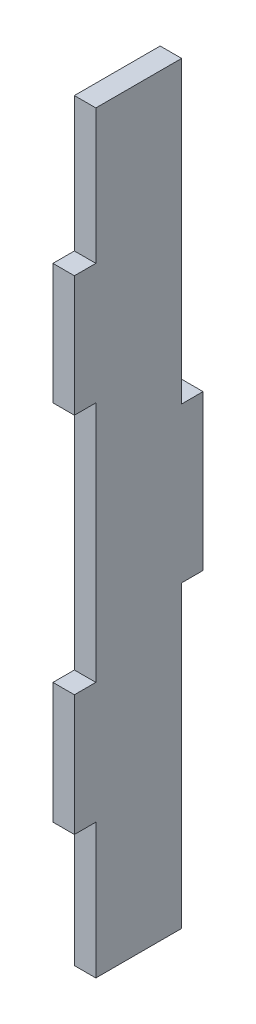
ISO-10303-21;
HEADER;
FILE_DESCRIPTION(('STEP AP214'),'2;1');
FILE_NAME('part.step','',(''),(''),'','','');
FILE_SCHEMA(('AUTOMOTIVE_DESIGN { 1 0 10303 214 1 1 1 1 }'));
ENDSEC;
DATA;
#1=APPLICATION_CONTEXT('core data for automotive mechanical design processes');
#2=APPLICATION_PROTOCOL_DEFINITION('international standard','automotive_design',2000,#1);
#3=PRODUCT_CONTEXT('',#1,'mechanical');
#4=PRODUCT('Part','Part','',(#3));
#5=PRODUCT_RELATED_PRODUCT_CATEGORY('part','',(#4));
#6=PRODUCT_DEFINITION_FORMATION('','',#4);
#7=PRODUCT_DEFINITION_CONTEXT('part definition',#1,'design');
#8=PRODUCT_DEFINITION('design','',#6,#7);
#9=PRODUCT_DEFINITION_SHAPE('','',#8);
#10=(LENGTH_UNIT() NAMED_UNIT(*) SI_UNIT(.MILLI.,.METRE.));
#11=(NAMED_UNIT(*) PLANE_ANGLE_UNIT() SI_UNIT($,.RADIAN.));
#12=(NAMED_UNIT(*) SI_UNIT($,.STERADIAN.) SOLID_ANGLE_UNIT());
#13=UNCERTAINTY_MEASURE_WITH_UNIT(LENGTH_MEASURE(1.E-05),#10,'distance_accuracy_value','');
#14=(GEOMETRIC_REPRESENTATION_CONTEXT(3) GLOBAL_UNCERTAINTY_ASSIGNED_CONTEXT((#13)) GLOBAL_UNIT_ASSIGNED_CONTEXT((#10,
#11,#12)) REPRESENTATION_CONTEXT('',''));
#15=CARTESIAN_POINT('',(0.,0.,0.));
#16=DIRECTION('',(0.,0.,1.));
#17=DIRECTION('',(1.,0.,0.));
#18=AXIS2_PLACEMENT_3D('',#15,#16,#17);
#19=CARTESIAN_POINT('',(3.,52.7,9.00000000000001));
#20=DIRECTION('',(0.,0.,-1.));
#21=DIRECTION('',(0.,1.,0.));
#22=AXIS2_PLACEMENT_3D('',#19,#20,#21);
#23=PLANE('',#22);
#24=DIRECTION('',(-1.,0.,0.));
#25=VECTOR('',#24,1.);
#26=CARTESIAN_POINT('',(3.,16.97,9.));
#27=LINE('',#26,#25);
#28=CARTESIAN_POINT('',(3.,16.97,9.));
#29=VERTEX_POINT('',#28);
#30=CARTESIAN_POINT('',(0.,16.97,9.));
#31=VERTEX_POINT('',#30);
#32=EDGE_CURVE('E230',#29,#31,#27,.T.);
#33=ORIENTED_EDGE('',*,*,#32,.F.);
#34=DIRECTION('',(0.,-1.,0.));
#35=VECTOR('',#34,1.);
#36=CARTESIAN_POINT('',(3.,52.7,9.00000000000001));
#37=LINE('',#36,#35);
#38=CARTESIAN_POINT('',(3.,33.87,9.));
#39=VERTEX_POINT('',#38);
#40=EDGE_CURVE('E41',#39,#29,#37,.T.);
#41=ORIENTED_EDGE('',*,*,#40,.F.);
#42=DIRECTION('',(-1.,0.,0.));
#43=VECTOR('',#42,1.);
#44=CARTESIAN_POINT('',(3.,33.87,9.));
#45=LINE('',#44,#43);
#46=CARTESIAN_POINT('',(0.,33.87,9.));
#47=VERTEX_POINT('',#46);
#48=EDGE_CURVE('E232',#39,#47,#45,.T.);
#49=ORIENTED_EDGE('',*,*,#48,.T.);
#50=DIRECTION('',(0.,-1.,0.));
#51=VECTOR('',#50,1.);
#52=CARTESIAN_POINT('',(0.,52.7,9.00000000000001));
#53=LINE('',#52,#51);
#54=EDGE_CURVE('E219',#47,#31,#53,.T.);
#55=ORIENTED_EDGE('',*,*,#54,.T.);
#56=EDGE_LOOP('',(#33,#41,#49,#55));
#57=FACE_BOUND('',#56,.T.);
#58=ADVANCED_FACE('F32',(#57),#23,.F.);
#59=CARTESIAN_POINT('',(0.,-16.89,9.));
#60=VERTEX_POINT('',#59);
#61=CARTESIAN_POINT('',(0.,-33.82,8.99999999999999));
#62=VERTEX_POINT('',#61);
#63=EDGE_CURVE('E217',#60,#62,#53,.T.);
#64=ORIENTED_EDGE('',*,*,#63,.T.);
#65=DIRECTION('',(-1.,0.,0.));
#66=VECTOR('',#65,1.);
#67=CARTESIAN_POINT('',(3.,-33.82,8.99999999999999));
#68=LINE('',#67,#66);
#69=CARTESIAN_POINT('',(3.,-33.82,8.99999999999999));
#70=VERTEX_POINT('',#69);
#71=EDGE_CURVE('E157',#70,#62,#68,.T.);
#72=ORIENTED_EDGE('',*,*,#71,.F.);
#73=CARTESIAN_POINT('',(3.,-16.89,9.));
#74=VERTEX_POINT('',#73);
#75=EDGE_CURVE('E214',#74,#70,#37,.T.);
#76=ORIENTED_EDGE('',*,*,#75,.F.);
#77=DIRECTION('',(-1.,0.,0.));
#78=VECTOR('',#77,1.);
#79=CARTESIAN_POINT('',(3.,-16.89,9.));
#80=LINE('',#79,#78);
#81=EDGE_CURVE('E253',#74,#60,#80,.T.);
#82=ORIENTED_EDGE('',*,*,#81,.T.);
#83=EDGE_LOOP('',(#64,#72,#76,#82));
#84=FACE_BOUND('',#83,.T.);
#85=ADVANCED_FACE('F310',(#84),#23,.F.);
#86=CARTESIAN_POINT('',(3.,-52.7,8.99999999999999));
#87=DIRECTION('',(0.,1.,0.));
#88=DIRECTION('',(0.,0.,1.));
#89=AXIS2_PLACEMENT_3D('',#86,#87,#88);
#90=PLANE('',#89);
#91=DIRECTION('',(-1.,0.,0.));
#92=VECTOR('',#91,1.);
#93=CARTESIAN_POINT('',(3.,-52.7,5.99999999999999));
#94=LINE('',#93,#92);
#95=CARTESIAN_POINT('',(3.,-52.7,5.99999999999999));
#96=VERTEX_POINT('',#95);
#97=CARTESIAN_POINT('',(0.,-52.7,5.99999999999999));
#98=VERTEX_POINT('',#97);
#99=EDGE_CURVE('E147',#96,#98,#94,.T.);
#100=ORIENTED_EDGE('',*,*,#99,.T.);
#101=DIRECTION('',(0.,0.,-1.));
#102=VECTOR('',#101,1.);
#103=CARTESIAN_POINT('',(0.,-52.7,8.99999999999999));
#104=LINE('',#103,#102);
#105=CARTESIAN_POINT('',(0.,-52.7,-6.00000000000001));
#106=VERTEX_POINT('',#105);
#107=EDGE_CURVE('E36',#98,#106,#104,.T.);
#108=ORIENTED_EDGE('',*,*,#107,.T.);
#109=DIRECTION('',(1.,0.,0.));
#110=VECTOR('',#109,1.);
#111=CARTESIAN_POINT('',(0.,-52.7,-6.00000000000001));
#112=LINE('',#111,#110);
#113=CARTESIAN_POINT('',(3.,-52.7,-6.00000000000001));
#114=VERTEX_POINT('',#113);
#115=EDGE_CURVE('E171',#106,#114,#112,.T.);
#116=ORIENTED_EDGE('',*,*,#115,.T.);
#117=DIRECTION('',(0.,0.,-1.));
#118=VECTOR('',#117,1.);
#119=CARTESIAN_POINT('',(3.,-52.7,8.99999999999999));
#120=LINE('',#119,#118);
#121=EDGE_CURVE('E11',#96,#114,#120,.T.);
#122=ORIENTED_EDGE('',*,*,#121,.F.);
#123=EDGE_LOOP('',(#100,#108,#116,#122));
#124=FACE_BOUND('',#123,.T.);
#125=ADVANCED_FACE('F169',(#124),#90,.F.);
#126=CARTESIAN_POINT('',(3.,0.,0.));
#127=DIRECTION('',(1.,0.,0.));
#128=DIRECTION('',(0.,0.,-1.));
#129=AXIS2_PLACEMENT_3D('',#126,#127,#128);
#130=PLANE('',#129);
#131=DIRECTION('',(0.,0.,-1.));
#132=VECTOR('',#131,1.);
#133=CARTESIAN_POINT('',(3.,-33.82,0.));
#134=LINE('',#133,#132);
#135=CARTESIAN_POINT('',(3.,-33.82,5.99999999999999));
#136=VERTEX_POINT('',#135);
#137=EDGE_CURVE('E158',#70,#136,#134,.T.);
#138=ORIENTED_EDGE('',*,*,#137,.T.);
#139=DIRECTION('',(0.,1.,0.));
#140=VECTOR('',#139,1.);
#141=CARTESIAN_POINT('',(3.,0.,5.99999999999999));
#142=LINE('',#141,#140);
#143=EDGE_CURVE('E150',#96,#136,#142,.T.);
#144=ORIENTED_EDGE('',*,*,#143,.F.);
#145=ORIENTED_EDGE('',*,*,#121,.T.);
#146=DIRECTION('',(0.,-1.,0.));
#147=VECTOR('',#146,1.);
#148=CARTESIAN_POINT('',(3.,-52.7,-6.00000000000001));
#149=LINE('',#148,#147);
#150=CARTESIAN_POINT('',(3.,-10.835,-6.00000000000001));
#151=VERTEX_POINT('',#150);
#152=EDGE_CURVE('E183',#151,#114,#149,.T.);
#153=ORIENTED_EDGE('',*,*,#152,.F.);
#154=DIRECTION('',(0.,0.,1.));
#155=VECTOR('',#154,1.);
#156=CARTESIAN_POINT('',(3.,-10.835,-9.00000000000001));
#157=LINE('',#156,#155);
#158=CARTESIAN_POINT('',(3.,-10.835,-9.00000000000001));
#159=VERTEX_POINT('',#158);
#160=EDGE_CURVE('E204',#159,#151,#157,.T.);
#161=ORIENTED_EDGE('',*,*,#160,.F.);
#162=DIRECTION('',(0.,1.,0.));
#163=VECTOR('',#162,1.);
#164=CARTESIAN_POINT('',(3.,52.7,-8.99999999999999));
#165=LINE('',#164,#163);
#166=CARTESIAN_POINT('',(3.,10.835,-9.));
#167=VERTEX_POINT('',#166);
#168=EDGE_CURVE('E208',#159,#167,#165,.T.);
#169=ORIENTED_EDGE('',*,*,#168,.T.);
#170=DIRECTION('',(0.,0.,-1.));
#171=VECTOR('',#170,1.);
#172=CARTESIAN_POINT('',(3.,10.835,-9.));
#173=LINE('',#172,#171);
#174=CARTESIAN_POINT('',(3.,10.835,-6.));
#175=VERTEX_POINT('',#174);
#176=EDGE_CURVE('E192',#175,#167,#173,.T.);
#177=ORIENTED_EDGE('',*,*,#176,.F.);
#178=DIRECTION('',(0.,-1.,0.));
#179=VECTOR('',#178,1.);
#180=CARTESIAN_POINT('',(3.,52.7,-5.99999999999999));
#181=LINE('',#180,#179);
#182=CARTESIAN_POINT('',(3.,52.7,-5.99999999999999));
#183=VERTEX_POINT('',#182);
#184=EDGE_CURVE('E196',#183,#175,#181,.T.);
#185=ORIENTED_EDGE('',*,*,#184,.F.);
#186=DIRECTION('',(0.,0.,1.));
#187=VECTOR('',#186,1.);
#188=CARTESIAN_POINT('',(3.,52.7,9.00000000000001));
#189=LINE('',#188,#187);
#190=CARTESIAN_POINT('',(3.,52.7,6.));
#191=VERTEX_POINT('',#190);
#192=EDGE_CURVE('E211',#183,#191,#189,.T.);
#193=ORIENTED_EDGE('',*,*,#192,.T.);
#194=DIRECTION('',(0.,-1.,0.));
#195=VECTOR('',#194,1.);
#196=CARTESIAN_POINT('',(3.,0.,6.00000000000001));
#197=LINE('',#196,#195);
#198=CARTESIAN_POINT('',(3.,33.87,6.00000000000001));
#199=VERTEX_POINT('',#198);
#200=EDGE_CURVE('E259',#191,#199,#197,.T.);
#201=ORIENTED_EDGE('',*,*,#200,.T.);
#202=DIRECTION('',(0.,0.,-1.));
#203=VECTOR('',#202,1.);
#204=CARTESIAN_POINT('',(3.,33.87,0.));
#205=LINE('',#204,#203);
#206=EDGE_CURVE('E262',#39,#199,#205,.T.);
#207=ORIENTED_EDGE('',*,*,#206,.F.);
#208=ORIENTED_EDGE('',*,*,#40,.T.);
#209=DIRECTION('',(0.,0.,1.));
#210=VECTOR('',#209,1.);
#211=CARTESIAN_POINT('',(3.,16.97,0.));
#212=LINE('',#211,#210);
#213=CARTESIAN_POINT('',(3.,16.97,6.00000000000001));
#214=VERTEX_POINT('',#213);
#215=EDGE_CURVE('E251',#214,#29,#212,.T.);
#216=ORIENTED_EDGE('',*,*,#215,.F.);
#217=DIRECTION('',(0.,1.,0.));
#218=VECTOR('',#217,1.);
#219=CARTESIAN_POINT('',(3.,0.,6.00000000000001));
#220=LINE('',#219,#218);
#221=CARTESIAN_POINT('',(3.,-16.89,6.00000000000001));
#222=VERTEX_POINT('',#221);
#223=EDGE_CURVE('E442',#222,#214,#220,.T.);
#224=ORIENTED_EDGE('',*,*,#223,.F.);
#225=DIRECTION('',(0.,0.,1.));
#226=VECTOR('',#225,1.);
#227=CARTESIAN_POINT('',(3.,-16.89,0.));
#228=LINE('',#227,#226);
#229=EDGE_CURVE('E247',#222,#74,#228,.T.);
#230=ORIENTED_EDGE('',*,*,#229,.T.);
#231=ORIENTED_EDGE('',*,*,#75,.T.);
#232=EDGE_LOOP('',(#138,#144,#145,#153,#161,#169,#177,#185,#193,#201,#207,#208,#216,#224,#230,#231));
#233=FACE_BOUND('',#232,.T.);
#234=ADVANCED_FACE('F162',(#233),#130,.T.);
#235=CARTESIAN_POINT('',(0.,0.,0.));
#236=DIRECTION('',(1.,0.,0.));
#237=DIRECTION('',(0.,0.,-1.));
#238=AXIS2_PLACEMENT_3D('',#235,#236,#237);
#239=PLANE('',#238);
#240=DIRECTION('',(0.,1.,0.));
#241=VECTOR('',#240,1.);
#242=CARTESIAN_POINT('',(0.,0.,5.99999999999999));
#243=LINE('',#242,#241);
#244=CARTESIAN_POINT('',(0.,-33.82,5.99999999999999));
#245=VERTEX_POINT('',#244);
#246=EDGE_CURVE('E153',#98,#245,#243,.T.);
#247=ORIENTED_EDGE('',*,*,#246,.T.);
#248=DIRECTION('',(0.,0.,-1.));
#249=VECTOR('',#248,1.);
#250=CARTESIAN_POINT('',(0.,-33.82,0.));
#251=LINE('',#250,#249);
#252=EDGE_CURVE('E166',#62,#245,#251,.T.);
#253=ORIENTED_EDGE('',*,*,#252,.F.);
#254=ORIENTED_EDGE('',*,*,#63,.F.);
#255=DIRECTION('',(0.,0.,1.));
#256=VECTOR('',#255,1.);
#257=CARTESIAN_POINT('',(0.,-16.89,0.));
#258=LINE('',#257,#256);
#259=CARTESIAN_POINT('',(0.,-16.89,6.00000000000001));
#260=VERTEX_POINT('',#259);
#261=EDGE_CURVE('E242',#260,#60,#258,.T.);
#262=ORIENTED_EDGE('',*,*,#261,.F.);
#263=DIRECTION('',(0.,1.,0.));
#264=VECTOR('',#263,1.);
#265=CARTESIAN_POINT('',(0.,0.,6.00000000000001));
#266=LINE('',#265,#264);
#267=CARTESIAN_POINT('',(0.,16.97,6.00000000000001));
#268=VERTEX_POINT('',#267);
#269=EDGE_CURVE('E240',#260,#268,#266,.T.);
#270=ORIENTED_EDGE('',*,*,#269,.T.);
#271=DIRECTION('',(0.,0.,1.));
#272=VECTOR('',#271,1.);
#273=CARTESIAN_POINT('',(0.,16.97,0.));
#274=LINE('',#273,#272);
#275=EDGE_CURVE('E49',#268,#31,#274,.T.);
#276=ORIENTED_EDGE('',*,*,#275,.T.);
#277=ORIENTED_EDGE('',*,*,#54,.F.);
#278=DIRECTION('',(0.,0.,-1.));
#279=VECTOR('',#278,1.);
#280=CARTESIAN_POINT('',(0.,33.87,0.));
#281=LINE('',#280,#279);
#282=CARTESIAN_POINT('',(0.,33.87,6.00000000000001));
#283=VERTEX_POINT('',#282);
#284=EDGE_CURVE('E236',#47,#283,#281,.T.);
#285=ORIENTED_EDGE('',*,*,#284,.T.);
#286=DIRECTION('',(0.,-1.,0.));
#287=VECTOR('',#286,1.);
#288=CARTESIAN_POINT('',(0.,0.,6.00000000000001));
#289=LINE('',#288,#287);
#290=CARTESIAN_POINT('',(0.,52.7,6.00000000000001));
#291=VERTEX_POINT('',#290);
#292=EDGE_CURVE('E264',#291,#283,#289,.T.);
#293=ORIENTED_EDGE('',*,*,#292,.F.);
#294=DIRECTION('',(0.,0.,1.));
#295=VECTOR('',#294,1.);
#296=CARTESIAN_POINT('',(0.,52.7,9.00000000000001));
#297=LINE('',#296,#295);
#298=CARTESIAN_POINT('',(0.,52.7,-5.99999999999999));
#299=VERTEX_POINT('',#298);
#300=EDGE_CURVE('E178',#299,#291,#297,.T.);
#301=ORIENTED_EDGE('',*,*,#300,.F.);
#302=DIRECTION('',(0.,-1.,0.));
#303=VECTOR('',#302,1.);
#304=CARTESIAN_POINT('',(0.,52.7,-5.99999999999999));
#305=LINE('',#304,#303);
#306=CARTESIAN_POINT('',(0.,10.835,-6.));
#307=VERTEX_POINT('',#306);
#308=EDGE_CURVE('E188',#299,#307,#305,.T.);
#309=ORIENTED_EDGE('',*,*,#308,.T.);
#310=DIRECTION('',(0.,0.,-1.));
#311=VECTOR('',#310,1.);
#312=CARTESIAN_POINT('',(0.,10.835,-9.));
#313=LINE('',#312,#311);
#314=CARTESIAN_POINT('',(0.,10.835,-9.));
#315=VERTEX_POINT('',#314);
#316=EDGE_CURVE('E191',#307,#315,#313,.T.);
#317=ORIENTED_EDGE('',*,*,#316,.T.);
#318=DIRECTION('',(0.,1.,0.));
#319=VECTOR('',#318,1.);
#320=CARTESIAN_POINT('',(0.,52.7,-8.99999999999999));
#321=LINE('',#320,#319);
#322=CARTESIAN_POINT('',(0.,-10.835,-9.00000000000001));
#323=VERTEX_POINT('',#322);
#324=EDGE_CURVE('E174',#323,#315,#321,.T.);
#325=ORIENTED_EDGE('',*,*,#324,.F.);
#326=DIRECTION('',(0.,0.,1.));
#327=VECTOR('',#326,1.);
#328=CARTESIAN_POINT('',(0.,-10.835,-9.00000000000001));
#329=LINE('',#328,#327);
#330=CARTESIAN_POINT('',(0.,-10.835,-6.00000000000001));
#331=VERTEX_POINT('',#330);
#332=EDGE_CURVE('E269',#323,#331,#329,.T.);
#333=ORIENTED_EDGE('',*,*,#332,.T.);
#334=DIRECTION('',(0.,-1.,0.));
#335=VECTOR('',#334,1.);
#336=CARTESIAN_POINT('',(0.,-52.7,-6.00000000000001));
#337=LINE('',#336,#335);
#338=EDGE_CURVE('E187',#331,#106,#337,.T.);
#339=ORIENTED_EDGE('',*,*,#338,.T.);
#340=ORIENTED_EDGE('',*,*,#107,.F.);
#341=EDGE_LOOP('',(#247,#253,#254,#262,#270,#276,#277,#285,#293,#301,#309,#317,#325,#333,#339,#340));
#342=FACE_BOUND('',#341,.T.);
#343=ADVANCED_FACE('F235',(#342),#239,.F.);
#344=CARTESIAN_POINT('',(3.,52.7,-8.99999999999999));
#345=DIRECTION('',(0.,0.,1.));
#346=DIRECTION('',(0.,-1.,0.));
#347=AXIS2_PLACEMENT_3D('',#344,#345,#346);
#348=PLANE('',#347);
#349=ORIENTED_EDGE('',*,*,#168,.F.);
#350=DIRECTION('',(1.,0.,0.));
#351=VECTOR('',#350,1.);
#352=CARTESIAN_POINT('',(0.,-10.835,-9.00000000000001));
#353=LINE('',#352,#351);
#354=EDGE_CURVE('E180',#323,#159,#353,.T.);
#355=ORIENTED_EDGE('',*,*,#354,.F.);
#356=ORIENTED_EDGE('',*,*,#324,.T.);
#357=DIRECTION('',(1.,0.,0.));
#358=VECTOR('',#357,1.);
#359=CARTESIAN_POINT('',(0.,10.835,-9.));
#360=LINE('',#359,#358);
#361=EDGE_CURVE('E201',#315,#167,#360,.T.);
#362=ORIENTED_EDGE('',*,*,#361,.T.);
#363=EDGE_LOOP('',(#349,#355,#356,#362));
#364=FACE_BOUND('',#363,.T.);
#365=ADVANCED_FACE('F34',(#364),#348,.F.);
#366=CARTESIAN_POINT('',(3.,52.7,9.00000000000001));
#367=DIRECTION('',(0.,-1.,0.));
#368=DIRECTION('',(0.,0.,-1.));
#369=AXIS2_PLACEMENT_3D('',#366,#367,#368);
#370=PLANE('',#369);
#371=ORIENTED_EDGE('',*,*,#300,.T.);
#372=DIRECTION('',(-1.,0.,0.));
#373=VECTOR('',#372,1.);
#374=CARTESIAN_POINT('',(3.,52.7,6.));
#375=LINE('',#374,#373);
#376=EDGE_CURVE('E57',#191,#291,#375,.T.);
#377=ORIENTED_EDGE('',*,*,#376,.F.);
#378=ORIENTED_EDGE('',*,*,#192,.F.);
#379=DIRECTION('',(1.,0.,0.));
#380=VECTOR('',#379,1.);
#381=CARTESIAN_POINT('',(0.,52.7,-5.99999999999999));
#382=LINE('',#381,#380);
#383=EDGE_CURVE('E195',#299,#183,#382,.T.);
#384=ORIENTED_EDGE('',*,*,#383,.F.);
#385=EDGE_LOOP('',(#371,#377,#378,#384));
#386=FACE_BOUND('',#385,.T.);
#387=ADVANCED_FACE('F292',(#386),#370,.F.);
#388=CARTESIAN_POINT('',(0.,10.835,-9.));
#389=DIRECTION('',(0.,-1.,0.));
#390=DIRECTION('',(0.,0.,-1.));
#391=AXIS2_PLACEMENT_3D('',#388,#389,#390);
#392=PLANE('',#391);
#393=ORIENTED_EDGE('',*,*,#176,.T.);
#394=ORIENTED_EDGE('',*,*,#361,.F.);
#395=ORIENTED_EDGE('',*,*,#316,.F.);
#396=DIRECTION('',(1.,0.,0.));
#397=VECTOR('',#396,1.);
#398=CARTESIAN_POINT('',(0.,10.835,-6.));
#399=LINE('',#398,#397);
#400=EDGE_CURVE('E205',#307,#175,#399,.T.);
#401=ORIENTED_EDGE('',*,*,#400,.T.);
#402=EDGE_LOOP('',(#393,#394,#395,#401));
#403=FACE_BOUND('',#402,.T.);
#404=ADVANCED_FACE('F283',(#403),#392,.F.);
#405=CARTESIAN_POINT('',(0.,52.7,-5.99999999999999));
#406=DIRECTION('',(0.,0.,1.));
#407=DIRECTION('',(0.,-1.,0.));
#408=AXIS2_PLACEMENT_3D('',#405,#406,#407);
#409=PLANE('',#408);
#410=ORIENTED_EDGE('',*,*,#184,.T.);
#411=ORIENTED_EDGE('',*,*,#400,.F.);
#412=ORIENTED_EDGE('',*,*,#308,.F.);
#413=ORIENTED_EDGE('',*,*,#383,.T.);
#414=EDGE_LOOP('',(#410,#411,#412,#413));
#415=FACE_BOUND('',#414,.T.);
#416=ADVANCED_FACE('F288',(#415),#409,.F.);
#417=CARTESIAN_POINT('',(0.,-52.7,-6.00000000000001));
#418=DIRECTION('',(0.,0.,1.));
#419=DIRECTION('',(1.,0.,0.));
#420=AXIS2_PLACEMENT_3D('',#417,#418,#419);
#421=PLANE('',#420);
#422=ORIENTED_EDGE('',*,*,#152,.T.);
#423=ORIENTED_EDGE('',*,*,#115,.F.);
#424=ORIENTED_EDGE('',*,*,#338,.F.);
#425=DIRECTION('',(1.,0.,0.));
#426=VECTOR('',#425,1.);
#427=CARTESIAN_POINT('',(0.,-10.835,-6.00000000000001));
#428=LINE('',#427,#426);
#429=EDGE_CURVE('E175',#331,#151,#428,.T.);
#430=ORIENTED_EDGE('',*,*,#429,.T.);
#431=EDGE_LOOP('',(#422,#423,#424,#430));
#432=FACE_BOUND('',#431,.T.);
#433=ADVANCED_FACE('F276',(#432),#421,.F.);
#434=CARTESIAN_POINT('',(0.,-10.835,-9.00000000000001));
#435=DIRECTION('',(0.,1.,0.));
#436=DIRECTION('',(0.,0.,1.));
#437=AXIS2_PLACEMENT_3D('',#434,#435,#436);
#438=PLANE('',#437);
#439=ORIENTED_EDGE('',*,*,#160,.T.);
#440=ORIENTED_EDGE('',*,*,#429,.F.);
#441=ORIENTED_EDGE('',*,*,#332,.F.);
#442=ORIENTED_EDGE('',*,*,#354,.T.);
#443=EDGE_LOOP('',(#439,#440,#441,#442));
#444=FACE_BOUND('',#443,.T.);
#445=ADVANCED_FACE('F299',(#444),#438,.F.);
#446=CARTESIAN_POINT('',(3.,33.87,0.));
#447=DIRECTION('',(0.,1.,0.));
#448=DIRECTION('',(0.,0.,1.));
#449=AXIS2_PLACEMENT_3D('',#446,#447,#448);
#450=PLANE('',#449);
#451=ORIENTED_EDGE('',*,*,#284,.F.);
#452=ORIENTED_EDGE('',*,*,#48,.F.);
#453=ORIENTED_EDGE('',*,*,#206,.T.);
#454=DIRECTION('',(-1.,0.,0.));
#455=VECTOR('',#454,1.);
#456=CARTESIAN_POINT('',(3.,33.87,6.00000000000001));
#457=LINE('',#456,#455);
#458=EDGE_CURVE('E244',#199,#283,#457,.T.);
#459=ORIENTED_EDGE('',*,*,#458,.T.);
#460=EDGE_LOOP('',(#451,#452,#453,#459));
#461=FACE_BOUND('',#460,.T.);
#462=ADVANCED_FACE('F297',(#461),#450,.T.);
#463=CARTESIAN_POINT('',(3.,0.,6.00000000000001));
#464=DIRECTION('',(0.,0.,-1.));
#465=DIRECTION('',(0.,1.,0.));
#466=AXIS2_PLACEMENT_3D('',#463,#464,#465);
#467=PLANE('',#466);
#468=ORIENTED_EDGE('',*,*,#292,.T.);
#469=ORIENTED_EDGE('',*,*,#458,.F.);
#470=ORIENTED_EDGE('',*,*,#200,.F.);
#471=ORIENTED_EDGE('',*,*,#376,.T.);
#472=EDGE_LOOP('',(#468,#469,#470,#471));
#473=FACE_BOUND('',#472,.T.);
#474=ADVANCED_FACE('F295',(#473),#467,.F.);
#475=CARTESIAN_POINT('',(3.,16.97,0.));
#476=DIRECTION('',(0.,-1.,0.));
#477=DIRECTION('',(0.,0.,-1.));
#478=AXIS2_PLACEMENT_3D('',#475,#476,#477);
#479=PLANE('',#478);
#480=ORIENTED_EDGE('',*,*,#275,.F.);
#481=DIRECTION('',(-1.,0.,0.));
#482=VECTOR('',#481,1.);
#483=CARTESIAN_POINT('',(3.,16.97,6.00000000000001));
#484=LINE('',#483,#482);
#485=EDGE_CURVE('E257',#214,#268,#484,.T.);
#486=ORIENTED_EDGE('',*,*,#485,.F.);
#487=ORIENTED_EDGE('',*,*,#215,.T.);
#488=ORIENTED_EDGE('',*,*,#32,.T.);
#489=EDGE_LOOP('',(#480,#486,#487,#488));
#490=FACE_BOUND('',#489,.T.);
#491=ADVANCED_FACE('F305',(#490),#479,.T.);
#492=CARTESIAN_POINT('',(3.,-16.89,0.));
#493=DIRECTION('',(0.,-1.,0.));
#494=DIRECTION('',(0.,0.,-1.));
#495=AXIS2_PLACEMENT_3D('',#492,#493,#494);
#496=PLANE('',#495);
#497=ORIENTED_EDGE('',*,*,#261,.T.);
#498=ORIENTED_EDGE('',*,*,#81,.F.);
#499=ORIENTED_EDGE('',*,*,#229,.F.);
#500=DIRECTION('',(-1.,0.,0.));
#501=VECTOR('',#500,1.);
#502=CARTESIAN_POINT('',(3.,-16.89,6.00000000000001));
#503=LINE('',#502,#501);
#504=EDGE_CURVE('E255',#222,#260,#503,.T.);
#505=ORIENTED_EDGE('',*,*,#504,.T.);
#506=EDGE_LOOP('',(#497,#498,#499,#505));
#507=FACE_BOUND('',#506,.T.);
#508=ADVANCED_FACE('F394',(#507),#496,.F.);
#509=CARTESIAN_POINT('',(3.,0.,6.00000000000001));
#510=DIRECTION('',(0.,0.,1.));
#511=DIRECTION('',(1.,0.,0.));
#512=AXIS2_PLACEMENT_3D('',#509,#510,#511);
#513=PLANE('',#512);
#514=ORIENTED_EDGE('',*,*,#269,.F.);
#515=ORIENTED_EDGE('',*,*,#504,.F.);
#516=ORIENTED_EDGE('',*,*,#223,.T.);
#517=ORIENTED_EDGE('',*,*,#485,.T.);
#518=EDGE_LOOP('',(#514,#515,#516,#517));
#519=FACE_BOUND('',#518,.T.);
#520=ADVANCED_FACE('F402',(#519),#513,.T.);
#521=CARTESIAN_POINT('',(3.,0.,5.99999999999999));
#522=DIRECTION('',(0.,0.,1.));
#523=DIRECTION('',(0.,-1.,0.));
#524=AXIS2_PLACEMENT_3D('',#521,#522,#523);
#525=PLANE('',#524);
#526=ORIENTED_EDGE('',*,*,#246,.F.);
#527=ORIENTED_EDGE('',*,*,#99,.F.);
#528=ORIENTED_EDGE('',*,*,#143,.T.);
#529=DIRECTION('',(-1.,0.,0.));
#530=VECTOR('',#529,1.);
#531=CARTESIAN_POINT('',(3.,-33.82,5.99999999999999));
#532=LINE('',#531,#530);
#533=EDGE_CURVE('E199',#136,#245,#532,.T.);
#534=ORIENTED_EDGE('',*,*,#533,.T.);
#535=EDGE_LOOP('',(#526,#527,#528,#534));
#536=FACE_BOUND('',#535,.T.);
#537=ADVANCED_FACE('F149',(#536),#525,.T.);
#538=CARTESIAN_POINT('',(3.,-33.82,0.));
#539=DIRECTION('',(0.,1.,0.));
#540=DIRECTION('',(0.,0.,1.));
#541=AXIS2_PLACEMENT_3D('',#538,#539,#540);
#542=PLANE('',#541);
#543=ORIENTED_EDGE('',*,*,#252,.T.);
#544=ORIENTED_EDGE('',*,*,#533,.F.);
#545=ORIENTED_EDGE('',*,*,#137,.F.);
#546=ORIENTED_EDGE('',*,*,#71,.T.);
#547=EDGE_LOOP('',(#543,#544,#545,#546));
#548=FACE_BOUND('',#547,.T.);
#549=ADVANCED_FACE('F421',(#548),#542,.F.);
#550=CLOSED_SHELL('',(#58,#85,#125,#234,#343,#365,#387,#404,#416,#433,#445,#462,#474,#491,#508,
#520,#537,#549));
#551=MANIFOLD_SOLID_BREP('B2',#550);
#552=ADVANCED_BREP_SHAPE_REPRESENTATION('',(#18,#551),#14);
#553=SHAPE_DEFINITION_REPRESENTATION(#9,#552);
ENDSEC;
END-ISO-10303-21;
